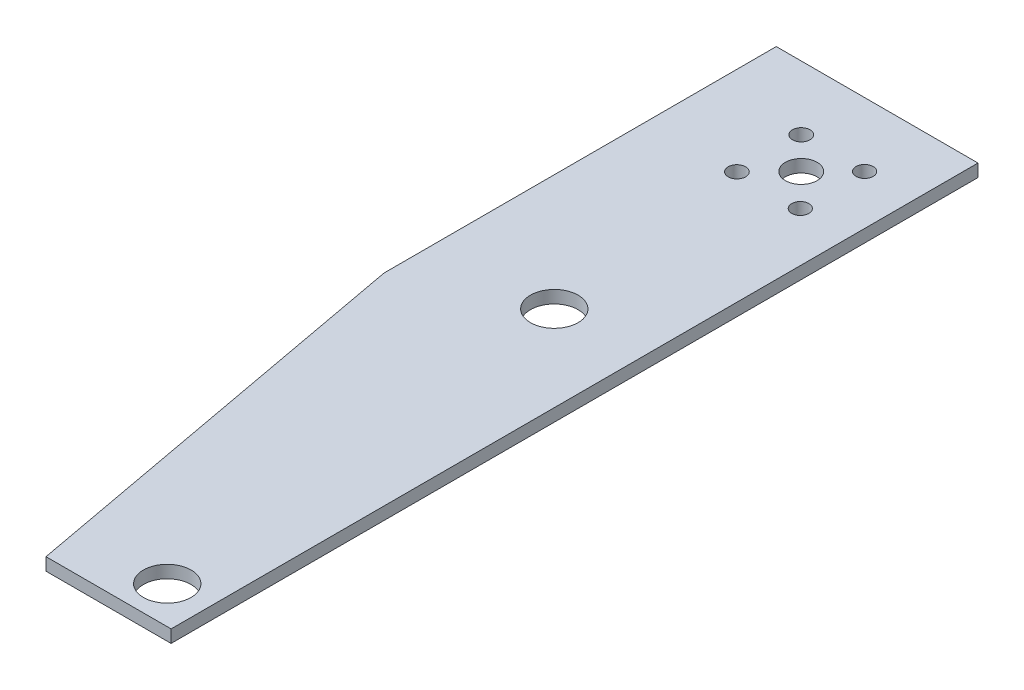
ISO-10303-21;
HEADER;
FILE_DESCRIPTION(('STEP AP214'),'2;1');
FILE_NAME('part.step','',(''),(''),'','','');
FILE_SCHEMA(('AUTOMOTIVE_DESIGN { 1 0 10303 214 1 1 1 1 }'));
ENDSEC;
DATA;
#1=APPLICATION_CONTEXT('core data for automotive mechanical design processes');
#2=APPLICATION_PROTOCOL_DEFINITION('international standard','automotive_design',2000,#1);
#3=PRODUCT_CONTEXT('',#1,'mechanical');
#4=PRODUCT('Part','Part','',(#3));
#5=PRODUCT_RELATED_PRODUCT_CATEGORY('part','',(#4));
#6=PRODUCT_DEFINITION_FORMATION('','',#4);
#7=PRODUCT_DEFINITION_CONTEXT('part definition',#1,'design');
#8=PRODUCT_DEFINITION('design','',#6,#7);
#9=PRODUCT_DEFINITION_SHAPE('','',#8);
#10=(LENGTH_UNIT() NAMED_UNIT(*) SI_UNIT(.MILLI.,.METRE.));
#11=(NAMED_UNIT(*) PLANE_ANGLE_UNIT() SI_UNIT($,.RADIAN.));
#12=(NAMED_UNIT(*) SI_UNIT($,.STERADIAN.) SOLID_ANGLE_UNIT());
#13=UNCERTAINTY_MEASURE_WITH_UNIT(LENGTH_MEASURE(1.E-05),#10,'distance_accuracy_value','');
#14=(GEOMETRIC_REPRESENTATION_CONTEXT(3) GLOBAL_UNCERTAINTY_ASSIGNED_CONTEXT((#13)) GLOBAL_UNIT_ASSIGNED_CONTEXT((#10,
#11,#12)) REPRESENTATION_CONTEXT('',''));
#15=CARTESIAN_POINT('',(0.,0.,0.));
#16=DIRECTION('',(0.,0.,1.));
#17=DIRECTION('',(1.,0.,0.));
#18=AXIS2_PLACEMENT_3D('',#15,#16,#17);
#19=CARTESIAN_POINT('',(0.,3.175,0.));
#20=DIRECTION('',(1.,0.,0.));
#21=DIRECTION('',(0.,0.,-1.));
#22=AXIS2_PLACEMENT_3D('',#19,#20,#21);
#23=PLANE('',#22);
#24=DIRECTION('',(0.,0.,1.));
#25=VECTOR('',#24,1.);
#26=CARTESIAN_POINT('',(0.,0.,0.));
#27=LINE('',#26,#25);
#28=CARTESIAN_POINT('',(0.,0.,-203.2));
#29=VERTEX_POINT('',#28);
#30=CARTESIAN_POINT('',(0.,0.,-104.430360781879));
#31=VERTEX_POINT('',#30);
#32=EDGE_CURVE('E107',#29,#31,#27,.T.);
#33=ORIENTED_EDGE('',*,*,#32,.T.);
#34=DIRECTION('',(0.,1.,0.));
#35=VECTOR('',#34,1.);
#36=CARTESIAN_POINT('',(0.,3.175,-104.430360781879));
#37=LINE('',#36,#35);
#38=CARTESIAN_POINT('',(0.,3.175,-104.430360781879));
#39=VERTEX_POINT('',#38);
#40=EDGE_CURVE('E46',#31,#39,#37,.T.);
#41=ORIENTED_EDGE('',*,*,#40,.T.);
#42=DIRECTION('',(0.,0.,1.));
#43=VECTOR('',#42,1.);
#44=CARTESIAN_POINT('',(0.,3.175,0.));
#45=LINE('',#44,#43);
#46=CARTESIAN_POINT('',(0.,3.175,-203.2));
#47=VERTEX_POINT('',#46);
#48=EDGE_CURVE('E94',#47,#39,#45,.T.);
#49=ORIENTED_EDGE('',*,*,#48,.F.);
#50=DIRECTION('',(0.,-1.,0.));
#51=VECTOR('',#50,1.);
#52=CARTESIAN_POINT('',(0.,3.175,-203.2));
#53=LINE('',#52,#51);
#54=EDGE_CURVE('E106',#47,#29,#53,.T.);
#55=ORIENTED_EDGE('',*,*,#54,.T.);
#56=EDGE_LOOP('',(#33,#41,#49,#55));
#57=FACE_BOUND('',#56,.T.);
#58=ADVANCED_FACE('F33',(#57),#23,.F.);
#59=CARTESIAN_POINT('',(0.,3.175,0.));
#60=DIRECTION('',(0.,0.,-1.));
#61=DIRECTION('',(-1.,0.,0.));
#62=AXIS2_PLACEMENT_3D('',#59,#60,#61);
#63=PLANE('',#62);
#64=DIRECTION('',(1.,0.,0.));
#65=VECTOR('',#64,1.);
#66=CARTESIAN_POINT('',(0.,3.175,0.));
#67=LINE('',#66,#65);
#68=CARTESIAN_POINT('',(19.2989582201056,3.175,0.));
#69=VERTEX_POINT('',#68);
#70=CARTESIAN_POINT('',(50.8,3.175,0.));
#71=VERTEX_POINT('',#70);
#72=EDGE_CURVE('E77',#69,#71,#67,.T.);
#73=ORIENTED_EDGE('',*,*,#72,.F.);
#74=DIRECTION('',(0.,1.,0.));
#75=VECTOR('',#74,1.);
#76=CARTESIAN_POINT('',(19.2989582201056,-6.825,0.));
#77=LINE('',#76,#75);
#78=CARTESIAN_POINT('',(19.2989582201056,0.,0.));
#79=VERTEX_POINT('',#78);
#80=EDGE_CURVE('E86',#79,#69,#77,.T.);
#81=ORIENTED_EDGE('',*,*,#80,.F.);
#82=DIRECTION('',(1.,0.,0.));
#83=VECTOR('',#82,1.);
#84=CARTESIAN_POINT('',(0.,0.,0.));
#85=LINE('',#84,#83);
#86=CARTESIAN_POINT('',(50.8,0.,0.));
#87=VERTEX_POINT('',#86);
#88=EDGE_CURVE('E110',#79,#87,#85,.T.);
#89=ORIENTED_EDGE('',*,*,#88,.T.);
#90=DIRECTION('',(0.,-1.,0.));
#91=VECTOR('',#90,1.);
#92=CARTESIAN_POINT('',(50.8,3.175,0.));
#93=LINE('',#92,#91);
#94=EDGE_CURVE('E40',#71,#87,#93,.T.);
#95=ORIENTED_EDGE('',*,*,#94,.F.);
#96=EDGE_LOOP('',(#73,#81,#89,#95));
#97=FACE_BOUND('',#96,.T.);
#98=ADVANCED_FACE('F96',(#97),#63,.F.);
#99=CARTESIAN_POINT('',(50.8,3.175,0.));
#100=DIRECTION('',(-1.,0.,0.));
#101=DIRECTION('',(0.,0.,1.));
#102=AXIS2_PLACEMENT_3D('',#99,#100,#101);
#103=PLANE('',#102);
#104=DIRECTION('',(0.,0.,-1.));
#105=VECTOR('',#104,1.);
#106=CARTESIAN_POINT('',(50.8,0.,0.));
#107=LINE('',#106,#105);
#108=CARTESIAN_POINT('',(50.8,0.,-203.2));
#109=VERTEX_POINT('',#108);
#110=EDGE_CURVE('E113',#87,#109,#107,.T.);
#111=ORIENTED_EDGE('',*,*,#110,.T.);
#112=DIRECTION('',(0.,-1.,0.));
#113=VECTOR('',#112,1.);
#114=CARTESIAN_POINT('',(50.8,3.175,-203.2));
#115=LINE('',#114,#113);
#116=CARTESIAN_POINT('',(50.8,3.175,-203.2));
#117=VERTEX_POINT('',#116);
#118=EDGE_CURVE('E117',#117,#109,#115,.T.);
#119=ORIENTED_EDGE('',*,*,#118,.F.);
#120=DIRECTION('',(0.,0.,-1.));
#121=VECTOR('',#120,1.);
#122=CARTESIAN_POINT('',(50.8,3.175,0.));
#123=LINE('',#122,#121);
#124=EDGE_CURVE('E99',#71,#117,#123,.T.);
#125=ORIENTED_EDGE('',*,*,#124,.F.);
#126=ORIENTED_EDGE('',*,*,#94,.T.);
#127=EDGE_LOOP('',(#111,#119,#125,#126));
#128=FACE_BOUND('',#127,.T.);
#129=ADVANCED_FACE('F189',(#128),#103,.F.);
#130=CARTESIAN_POINT('',(0.,3.175,-203.2));
#131=DIRECTION('',(0.,0.,1.));
#132=DIRECTION('',(1.,0.,0.));
#133=AXIS2_PLACEMENT_3D('',#130,#131,#132);
#134=PLANE('',#133);
#135=DIRECTION('',(-1.,0.,0.));
#136=VECTOR('',#135,1.);
#137=CARTESIAN_POINT('',(0.,0.,-203.2));
#138=LINE('',#137,#136);
#139=EDGE_CURVE('E72',#109,#29,#138,.T.);
#140=ORIENTED_EDGE('',*,*,#139,.T.);
#141=ORIENTED_EDGE('',*,*,#54,.F.);
#142=DIRECTION('',(-1.,0.,0.));
#143=VECTOR('',#142,1.);
#144=CARTESIAN_POINT('',(0.,3.175,-203.2));
#145=LINE('',#144,#143);
#146=EDGE_CURVE('E55',#117,#47,#145,.T.);
#147=ORIENTED_EDGE('',*,*,#146,.F.);
#148=ORIENTED_EDGE('',*,*,#118,.T.);
#149=EDGE_LOOP('',(#140,#141,#147,#148));
#150=FACE_BOUND('',#149,.T.);
#151=ADVANCED_FACE('F191',(#150),#134,.F.);
#152=CARTESIAN_POINT('',(0.,3.175,0.));
#153=DIRECTION('',(0.,-1.,0.));
#154=DIRECTION('',(0.,0.,-1.));
#155=AXIS2_PLACEMENT_3D('',#152,#153,#154);
#156=PLANE('',#155);
#157=CARTESIAN_POINT('',(40.4628482151692,3.175,-9.36892710950007));
#158=DIRECTION('',(0.,-1.,0.));
#159=DIRECTION('',(0.,0.,-1.));
#160=AXIS2_PLACEMENT_3D('',#157,#158,#159);
#161=CIRCLE('',#160,6.);
#162=CARTESIAN_POINT('',(40.4628482151692,3.175,-15.3689271095001));
#163=VERTEX_POINT('',#162);
#164=EDGE_CURVE('E170',#163,#163,#161,.T.);
#165=ORIENTED_EDGE('',*,*,#164,.T.);
#166=EDGE_LOOP('',(#165));
#167=FACE_BOUND('',#166,.T.);
#168=CARTESIAN_POINT('',(29.2592320919615,3.175,-118.036539738398));
#169=DIRECTION('',(0.,-1.,0.));
#170=DIRECTION('',(0.,0.,-1.));
#171=AXIS2_PLACEMENT_3D('',#168,#169,#170);
#172=CIRCLE('',#171,6.);
#173=CARTESIAN_POINT('',(29.2592320919615,3.175,-124.036539738398));
#174=VERTEX_POINT('',#173);
#175=EDGE_CURVE('E175',#174,#174,#172,.T.);
#176=ORIENTED_EDGE('',*,*,#175,.T.);
#177=EDGE_LOOP('',(#176));
#178=FACE_BOUND('',#177,.T.);
#179=CARTESIAN_POINT('',(38.3644890504687,3.175,-187.082300611746));
#180=DIRECTION('',(0.,1.,0.));
#181=DIRECTION('',(0.,0.,1.));
#182=AXIS2_PLACEMENT_3D('',#179,#180,#181);
#183=CIRCLE('',#182,2.15957980358489);
#184=CARTESIAN_POINT('',(38.3644890504687,3.175,-184.922720808161));
#185=VERTEX_POINT('',#184);
#186=EDGE_CURVE('E159',#185,#185,#183,.T.);
#187=ORIENTED_EDGE('',*,*,#186,.F.);
#188=EDGE_LOOP('',(#187));
#189=FACE_BOUND('',#188,.T.);
#190=CARTESIAN_POINT('',(22.3633641132707,3.175,-170.928460489847));
#191=DIRECTION('',(0.,1.,0.));
#192=DIRECTION('',(0.,0.,1.));
#193=AXIS2_PLACEMENT_3D('',#190,#191,#192);
#194=CIRCLE('',#193,2.20000000000001);
#195=CARTESIAN_POINT('',(22.3633641132707,3.175,-168.728460489847));
#196=VERTEX_POINT('',#195);
#197=EDGE_CURVE('E161',#196,#196,#194,.T.);
#198=ORIENTED_EDGE('',*,*,#197,.F.);
#199=EDGE_LOOP('',(#198));
#200=FACE_BOUND('',#199,.T.);
#201=CARTESIAN_POINT('',(38.3433397014616,3.175,-170.907565799161));
#202=DIRECTION('',(0.,1.,0.));
#203=DIRECTION('',(0.,0.,1.));
#204=AXIS2_PLACEMENT_3D('',#201,#202,#203);
#205=CIRCLE('',#204,2.15957980358489);
#206=CARTESIAN_POINT('',(38.3433397014616,3.175,-168.747985995576));
#207=VERTEX_POINT('',#206);
#208=EDGE_CURVE('E165',#207,#207,#205,.T.);
#209=ORIENTED_EDGE('',*,*,#208,.F.);
#210=EDGE_LOOP('',(#209));
#211=FACE_BOUND('',#210,.T.);
#212=CARTESIAN_POINT('',(30.3855134622778,3.175,-179.103195302432));
#213=DIRECTION('',(0.,1.,0.));
#214=DIRECTION('',(0.,0.,1.));
#215=AXIS2_PLACEMENT_3D('',#212,#213,#214);
#216=CIRCLE('',#215,4.00000000000001);
#217=CARTESIAN_POINT('',(30.3855134622778,3.175,-175.103195302432));
#218=VERTEX_POINT('',#217);
#219=EDGE_CURVE('E167',#218,#218,#216,.T.);
#220=ORIENTED_EDGE('',*,*,#219,.F.);
#221=EDGE_LOOP('',(#220));
#222=FACE_BOUND('',#221,.T.);
#223=CARTESIAN_POINT('',(22.3845134622778,3.175,-187.103195302432));
#224=DIRECTION('',(0.,1.,0.));
#225=DIRECTION('',(0.,0.,1.));
#226=AXIS2_PLACEMENT_3D('',#223,#224,#225);
#227=CIRCLE('',#226,2.20000000000001);
#228=CARTESIAN_POINT('',(22.3845134622778,3.175,-184.903195302432));
#229=VERTEX_POINT('',#228);
#230=EDGE_CURVE('E124',#229,#229,#227,.T.);
#231=ORIENTED_EDGE('',*,*,#230,.F.);
#232=EDGE_LOOP('',(#231));
#233=FACE_BOUND('',#232,.T.);
#234=ORIENTED_EDGE('',*,*,#48,.T.);
#235=DIRECTION('',(-0.181725106443971,0.,-0.983349371122963));
#236=VECTOR('',#235,1.);
#237=CARTESIAN_POINT('',(19.2989582201056,3.175,0.));
#238=LINE('',#237,#236);
#239=EDGE_CURVE('E88',#69,#39,#238,.T.);
#240=ORIENTED_EDGE('',*,*,#239,.F.);
#241=ORIENTED_EDGE('',*,*,#72,.T.);
#242=ORIENTED_EDGE('',*,*,#124,.T.);
#243=ORIENTED_EDGE('',*,*,#146,.T.);
#244=EDGE_LOOP('',(#234,#240,#241,#242,#243));
#245=FACE_BOUND('',#244,.T.);
#246=ADVANCED_FACE('F92',(#167,#178,#189,#200,#211,#222,#233,#245),#156,.F.);
#247=CARTESIAN_POINT('',(0.,0.,0.));
#248=DIRECTION('',(0.,-1.,0.));
#249=DIRECTION('',(0.,0.,-1.));
#250=AXIS2_PLACEMENT_3D('',#247,#248,#249);
#251=PLANE('',#250);
#252=DIRECTION('',(0.181725106443971,0.,0.983349371122963));
#253=VECTOR('',#252,1.);
#254=CARTESIAN_POINT('',(18.6616291476368,0.,-3.44870972907567));
#255=LINE('',#254,#253);
#256=EDGE_CURVE('E11',#31,#79,#255,.T.);
#257=ORIENTED_EDGE('',*,*,#256,.F.);
#258=ORIENTED_EDGE('',*,*,#32,.F.);
#259=ORIENTED_EDGE('',*,*,#139,.F.);
#260=ORIENTED_EDGE('',*,*,#110,.F.);
#261=ORIENTED_EDGE('',*,*,#88,.F.);
#262=EDGE_LOOP('',(#257,#258,#259,#260,#261));
#263=FACE_BOUND('',#262,.T.);
#264=CARTESIAN_POINT('',(40.4628482151692,0.,-9.36892710950007));
#265=DIRECTION('',(0.,-1.,0.));
#266=DIRECTION('',(0.,0.,-1.));
#267=AXIS2_PLACEMENT_3D('',#264,#265,#266);
#268=CIRCLE('',#267,6.);
#269=CARTESIAN_POINT('',(40.4628482151692,0.,-15.3689271095001));
#270=VERTEX_POINT('',#269);
#271=EDGE_CURVE('E178',#270,#270,#268,.T.);
#272=ORIENTED_EDGE('',*,*,#271,.F.);
#273=EDGE_LOOP('',(#272));
#274=FACE_BOUND('',#273,.T.);
#275=CARTESIAN_POINT('',(29.2592320919615,0.,-118.036539738398));
#276=DIRECTION('',(0.,-1.,0.));
#277=DIRECTION('',(0.,0.,-1.));
#278=AXIS2_PLACEMENT_3D('',#275,#276,#277);
#279=CIRCLE('',#278,6.);
#280=CARTESIAN_POINT('',(29.2592320919615,0.,-124.036539738398));
#281=VERTEX_POINT('',#280);
#282=EDGE_CURVE('E179',#281,#281,#279,.T.);
#283=ORIENTED_EDGE('',*,*,#282,.F.);
#284=EDGE_LOOP('',(#283));
#285=FACE_BOUND('',#284,.T.);
#286=CARTESIAN_POINT('',(38.3644890504687,0.,-187.082300611746));
#287=DIRECTION('',(0.,-1.,0.));
#288=DIRECTION('',(0.,0.,-1.));
#289=AXIS2_PLACEMENT_3D('',#286,#287,#288);
#290=CIRCLE('',#289,2.15957980358489);
#291=CARTESIAN_POINT('',(38.3644890504687,0.,-189.241880415331));
#292=VERTEX_POINT('',#291);
#293=EDGE_CURVE('E111',#292,#292,#290,.T.);
#294=ORIENTED_EDGE('',*,*,#293,.F.);
#295=EDGE_LOOP('',(#294));
#296=FACE_BOUND('',#295,.T.);
#297=CARTESIAN_POINT('',(22.3633641132707,0.,-170.928460489847));
#298=DIRECTION('',(0.,-1.,0.));
#299=DIRECTION('',(0.,0.,-1.));
#300=AXIS2_PLACEMENT_3D('',#297,#298,#299);
#301=CIRCLE('',#300,2.20000000000001);
#302=CARTESIAN_POINT('',(22.3633641132707,0.,-173.128460489847));
#303=VERTEX_POINT('',#302);
#304=EDGE_CURVE('E130',#303,#303,#301,.T.);
#305=ORIENTED_EDGE('',*,*,#304,.F.);
#306=EDGE_LOOP('',(#305));
#307=FACE_BOUND('',#306,.T.);
#308=CARTESIAN_POINT('',(38.3433397014616,0.,-170.907565799161));
#309=DIRECTION('',(0.,-1.,0.));
#310=DIRECTION('',(0.,0.,-1.));
#311=AXIS2_PLACEMENT_3D('',#308,#309,#310);
#312=CIRCLE('',#311,2.15957980358489);
#313=CARTESIAN_POINT('',(38.3433397014616,0.,-173.067145602746));
#314=VERTEX_POINT('',#313);
#315=EDGE_CURVE('E127',#314,#314,#312,.T.);
#316=ORIENTED_EDGE('',*,*,#315,.F.);
#317=EDGE_LOOP('',(#316));
#318=FACE_BOUND('',#317,.T.);
#319=CARTESIAN_POINT('',(30.3855134622778,0.,-179.103195302432));
#320=DIRECTION('',(0.,-1.,0.));
#321=DIRECTION('',(0.,0.,-1.));
#322=AXIS2_PLACEMENT_3D('',#319,#320,#321);
#323=CIRCLE('',#322,4.00000000000001);
#324=CARTESIAN_POINT('',(30.3855134622778,0.,-183.103195302432));
#325=VERTEX_POINT('',#324);
#326=EDGE_CURVE('E123',#325,#325,#323,.T.);
#327=ORIENTED_EDGE('',*,*,#326,.F.);
#328=EDGE_LOOP('',(#327));
#329=FACE_BOUND('',#328,.T.);
#330=CARTESIAN_POINT('',(22.3845134622778,0.,-187.103195302432));
#331=DIRECTION('',(0.,-1.,0.));
#332=DIRECTION('',(0.,0.,-1.));
#333=AXIS2_PLACEMENT_3D('',#330,#331,#332);
#334=CIRCLE('',#333,2.20000000000001);
#335=CARTESIAN_POINT('',(22.3845134622778,0.,-189.303195302432));
#336=VERTEX_POINT('',#335);
#337=EDGE_CURVE('E120',#336,#336,#334,.T.);
#338=ORIENTED_EDGE('',*,*,#337,.F.);
#339=EDGE_LOOP('',(#338));
#340=FACE_BOUND('',#339,.T.);
#341=ADVANCED_FACE('F138',(#263,#274,#285,#296,#307,#318,#329,#340),#251,.T.);
#342=CARTESIAN_POINT('',(22.3845134622778,-6.825,-187.103195302432));
#343=DIRECTION('',(0.,1.,0.));
#344=DIRECTION('',(0.,0.,1.));
#345=AXIS2_PLACEMENT_3D('',#342,#343,#344);
#346=CYLINDRICAL_SURFACE('',#345,2.20000000000001);
#347=ORIENTED_EDGE('',*,*,#337,.T.);
#348=EDGE_LOOP('',(#347));
#349=FACE_BOUND('',#348,.T.);
#350=ORIENTED_EDGE('',*,*,#230,.T.);
#351=EDGE_LOOP('',(#350));
#352=FACE_BOUND('',#351,.T.);
#353=ADVANCED_FACE('F141',(#349,#352),#346,.F.);
#354=CARTESIAN_POINT('',(30.3855134622778,-6.825,-179.103195302432));
#355=DIRECTION('',(0.,1.,0.));
#356=DIRECTION('',(0.,0.,1.));
#357=AXIS2_PLACEMENT_3D('',#354,#355,#356);
#358=CYLINDRICAL_SURFACE('',#357,4.00000000000001);
#359=ORIENTED_EDGE('',*,*,#326,.T.);
#360=EDGE_LOOP('',(#359));
#361=FACE_BOUND('',#360,.T.);
#362=ORIENTED_EDGE('',*,*,#219,.T.);
#363=EDGE_LOOP('',(#362));
#364=FACE_BOUND('',#363,.T.);
#365=ADVANCED_FACE('F154',(#361,#364),#358,.F.);
#366=CARTESIAN_POINT('',(38.3433397014616,-6.825,-170.907565799161));
#367=DIRECTION('',(0.,1.,0.));
#368=DIRECTION('',(0.,0.,1.));
#369=AXIS2_PLACEMENT_3D('',#366,#367,#368);
#370=CYLINDRICAL_SURFACE('',#369,2.15957980358489);
#371=ORIENTED_EDGE('',*,*,#315,.T.);
#372=EDGE_LOOP('',(#371));
#373=FACE_BOUND('',#372,.T.);
#374=ORIENTED_EDGE('',*,*,#208,.T.);
#375=EDGE_LOOP('',(#374));
#376=FACE_BOUND('',#375,.T.);
#377=ADVANCED_FACE('F252',(#373,#376),#370,.F.);
#378=CARTESIAN_POINT('',(22.3633641132707,-6.825,-170.928460489847));
#379=DIRECTION('',(0.,1.,0.));
#380=DIRECTION('',(0.,0.,1.));
#381=AXIS2_PLACEMENT_3D('',#378,#379,#380);
#382=CYLINDRICAL_SURFACE('',#381,2.20000000000001);
#383=ORIENTED_EDGE('',*,*,#304,.T.);
#384=EDGE_LOOP('',(#383));
#385=FACE_BOUND('',#384,.T.);
#386=ORIENTED_EDGE('',*,*,#197,.T.);
#387=EDGE_LOOP('',(#386));
#388=FACE_BOUND('',#387,.T.);
#389=ADVANCED_FACE('F245',(#385,#388),#382,.F.);
#390=CARTESIAN_POINT('',(38.3644890504687,-6.825,-187.082300611746));
#391=DIRECTION('',(0.,1.,0.));
#392=DIRECTION('',(0.,0.,1.));
#393=AXIS2_PLACEMENT_3D('',#390,#391,#392);
#394=CYLINDRICAL_SURFACE('',#393,2.15957980358489);
#395=ORIENTED_EDGE('',*,*,#293,.T.);
#396=EDGE_LOOP('',(#395));
#397=FACE_BOUND('',#396,.T.);
#398=ORIENTED_EDGE('',*,*,#186,.T.);
#399=EDGE_LOOP('',(#398));
#400=FACE_BOUND('',#399,.T.);
#401=ADVANCED_FACE('F135',(#397,#400),#394,.F.);
#402=CARTESIAN_POINT('',(29.2592320919615,10.,-118.036539738398));
#403=DIRECTION('',(0.,-1.,0.));
#404=DIRECTION('',(0.,0.,-1.));
#405=AXIS2_PLACEMENT_3D('',#402,#403,#404);
#406=CYLINDRICAL_SURFACE('',#405,6.);
#407=ORIENTED_EDGE('',*,*,#282,.T.);
#408=EDGE_LOOP('',(#407));
#409=FACE_BOUND('',#408,.T.);
#410=ORIENTED_EDGE('',*,*,#175,.F.);
#411=EDGE_LOOP('',(#410));
#412=FACE_BOUND('',#411,.T.);
#413=ADVANCED_FACE('F231',(#409,#412),#406,.F.);
#414=CARTESIAN_POINT('',(40.4628482151692,10.,-9.36892710950007));
#415=DIRECTION('',(0.,-1.,0.));
#416=DIRECTION('',(0.,0.,-1.));
#417=AXIS2_PLACEMENT_3D('',#414,#415,#416);
#418=CYLINDRICAL_SURFACE('',#417,6.);
#419=ORIENTED_EDGE('',*,*,#271,.T.);
#420=EDGE_LOOP('',(#419));
#421=FACE_BOUND('',#420,.T.);
#422=ORIENTED_EDGE('',*,*,#164,.F.);
#423=EDGE_LOOP('',(#422));
#424=FACE_BOUND('',#423,.T.);
#425=ADVANCED_FACE('F222',(#421,#424),#418,.F.);
#426=CARTESIAN_POINT('',(19.2989582201056,-6.825,0.));
#427=DIRECTION('',(0.983349371122963,0.,-0.181725106443971));
#428=DIRECTION('',(-0.181725106443971,0.,-0.983349371122963));
#429=AXIS2_PLACEMENT_3D('',#426,#427,#428);
#430=PLANE('',#429);
#431=ORIENTED_EDGE('',*,*,#256,.T.);
#432=ORIENTED_EDGE('',*,*,#80,.T.);
#433=ORIENTED_EDGE('',*,*,#239,.T.);
#434=ORIENTED_EDGE('',*,*,#40,.F.);
#435=EDGE_LOOP('',(#431,#432,#433,#434));
#436=FACE_BOUND('',#435,.T.);
#437=ADVANCED_FACE('F87',(#436),#430,.F.);
#438=CLOSED_SHELL('',(#58,#98,#129,#151,#246,#341,#353,#365,#377,#389,#401,#413,#425,#437));
#439=MANIFOLD_SOLID_BREP('B2',#438);
#440=ADVANCED_BREP_SHAPE_REPRESENTATION('',(#18,#439),#14);
#441=SHAPE_DEFINITION_REPRESENTATION(#9,#440);
ENDSEC;
END-ISO-10303-21;
